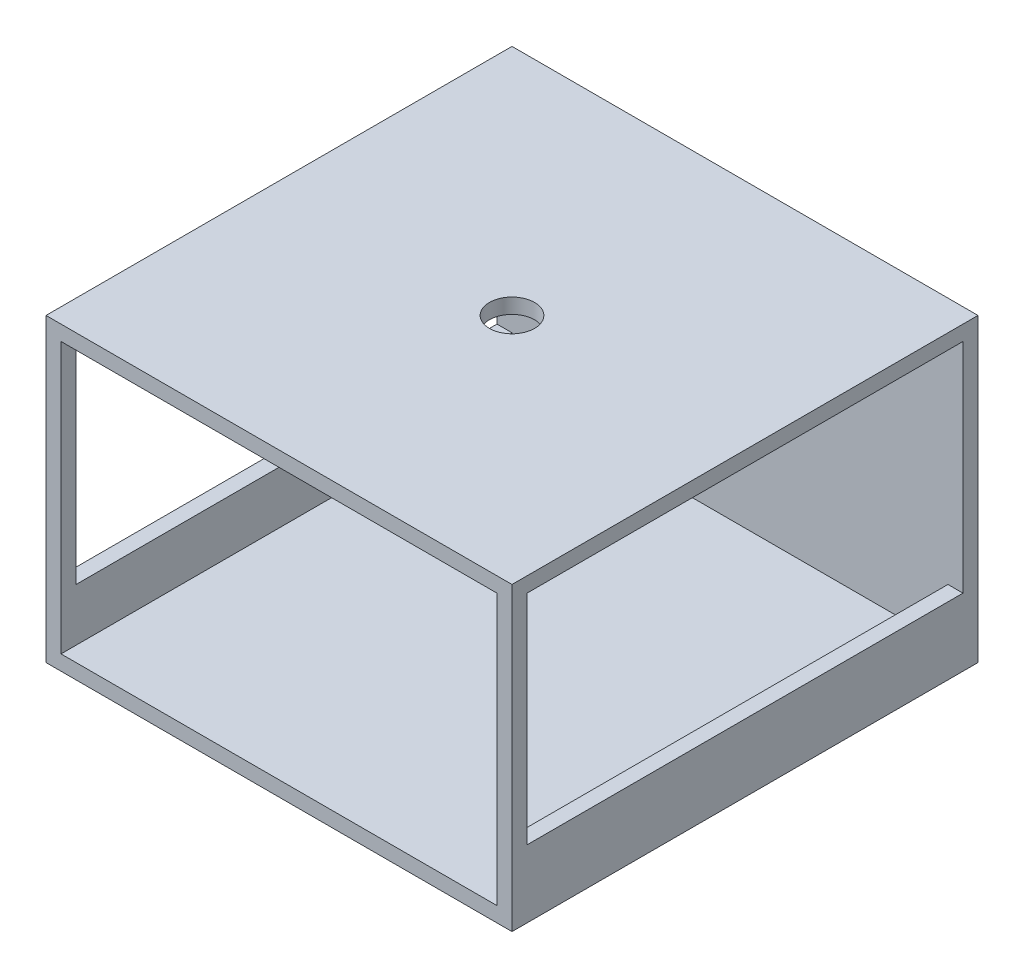
ISO-10303-21;
HEADER;
FILE_DESCRIPTION(('STEP AP214'),'2;1');
FILE_NAME('part.step','',(''),(''),'','','');
FILE_SCHEMA(('AUTOMOTIVE_DESIGN { 1 0 10303 214 1 1 1 1 }'));
ENDSEC;
DATA;
#1=APPLICATION_CONTEXT('core data for automotive mechanical design processes');
#2=APPLICATION_PROTOCOL_DEFINITION('international standard','automotive_design',2000,#1);
#3=PRODUCT_CONTEXT('',#1,'mechanical');
#4=PRODUCT('Part','Part','',(#3));
#5=PRODUCT_RELATED_PRODUCT_CATEGORY('part','',(#4));
#6=PRODUCT_DEFINITION_FORMATION('','',#4);
#7=PRODUCT_DEFINITION_CONTEXT('part definition',#1,'design');
#8=PRODUCT_DEFINITION('design','',#6,#7);
#9=PRODUCT_DEFINITION_SHAPE('','',#8);
#10=(LENGTH_UNIT() NAMED_UNIT(*) SI_UNIT(.MILLI.,.METRE.));
#11=(NAMED_UNIT(*) PLANE_ANGLE_UNIT() SI_UNIT($,.RADIAN.));
#12=(NAMED_UNIT(*) SI_UNIT($,.STERADIAN.) SOLID_ANGLE_UNIT());
#13=UNCERTAINTY_MEASURE_WITH_UNIT(LENGTH_MEASURE(1.E-05),#10,'distance_accuracy_value','');
#14=(GEOMETRIC_REPRESENTATION_CONTEXT(3) GLOBAL_UNCERTAINTY_ASSIGNED_CONTEXT((#13)) GLOBAL_UNIT_ASSIGNED_CONTEXT((#10,
#11,#12)) REPRESENTATION_CONTEXT('',''));
#15=CARTESIAN_POINT('',(0.,0.,0.));
#16=DIRECTION('',(0.,0.,1.));
#17=DIRECTION('',(1.,0.,0.));
#18=AXIS2_PLACEMENT_3D('',#15,#16,#17);
#19=CARTESIAN_POINT('',(-77.5,100.,77.5));
#20=DIRECTION('',(0.,0.,-1.));
#21=DIRECTION('',(-1.,0.,0.));
#22=AXIS2_PLACEMENT_3D('',#19,#20,#21);
#23=PLANE('',#22);
#24=DIRECTION('',(1.,0.,0.));
#25=VECTOR('',#24,1.);
#26=CARTESIAN_POINT('',(-77.5,0.,77.5));
#27=LINE('',#26,#25);
#28=CARTESIAN_POINT('',(-77.5,0.,77.5));
#29=VERTEX_POINT('',#28);
#30=CARTESIAN_POINT('',(77.5,0.,77.5));
#31=VERTEX_POINT('',#30);
#32=EDGE_CURVE('E217',#29,#31,#27,.T.);
#33=ORIENTED_EDGE('',*,*,#32,.T.);
#34=DIRECTION('',(0.,-1.,0.));
#35=VECTOR('',#34,1.);
#36=CARTESIAN_POINT('',(77.5,100.,77.5));
#37=LINE('',#36,#35);
#38=CARTESIAN_POINT('',(77.5,100.,77.5));
#39=VERTEX_POINT('',#38);
#40=EDGE_CURVE('E223',#39,#31,#37,.T.);
#41=ORIENTED_EDGE('',*,*,#40,.F.);
#42=DIRECTION('',(1.,0.,0.));
#43=VECTOR('',#42,1.);
#44=CARTESIAN_POINT('',(-77.5,100.,77.5));
#45=LINE('',#44,#43);
#46=CARTESIAN_POINT('',(-77.5,100.,77.5));
#47=VERTEX_POINT('',#46);
#48=EDGE_CURVE('E221',#47,#39,#45,.T.);
#49=ORIENTED_EDGE('',*,*,#48,.F.);
#50=DIRECTION('',(0.,-1.,0.));
#51=VECTOR('',#50,1.);
#52=CARTESIAN_POINT('',(-77.5,100.,77.5));
#53=LINE('',#52,#51);
#54=EDGE_CURVE('E233',#47,#29,#53,.T.);
#55=ORIENTED_EDGE('',*,*,#54,.T.);
#56=EDGE_LOOP('',(#33,#41,#49,#55));
#57=FACE_BOUND('',#56,.T.);
#58=DIRECTION('',(1.,0.,0.));
#59=VECTOR('',#58,1.);
#60=CARTESIAN_POINT('',(0.,5.,77.5));
#61=LINE('',#60,#59);
#62=CARTESIAN_POINT('',(-72.5,5.,77.5));
#63=VERTEX_POINT('',#62);
#64=CARTESIAN_POINT('',(72.5,5.,77.5));
#65=VERTEX_POINT('',#64);
#66=EDGE_CURVE('E194',#63,#65,#61,.T.);
#67=ORIENTED_EDGE('',*,*,#66,.F.);
#68=DIRECTION('',(0.,-1.,0.));
#69=VECTOR('',#68,1.);
#70=CARTESIAN_POINT('',(-72.5,100.,77.5));
#71=LINE('',#70,#69);
#72=CARTESIAN_POINT('',(-72.5,95.,77.5));
#73=VERTEX_POINT('',#72);
#74=EDGE_CURVE('E199',#73,#63,#71,.T.);
#75=ORIENTED_EDGE('',*,*,#74,.F.);
#76=DIRECTION('',(1.,0.,0.));
#77=VECTOR('',#76,1.);
#78=CARTESIAN_POINT('',(0.,95.,77.5));
#79=LINE('',#78,#77);
#80=CARTESIAN_POINT('',(72.5,95.,77.5));
#81=VERTEX_POINT('',#80);
#82=EDGE_CURVE('E204',#73,#81,#79,.T.);
#83=ORIENTED_EDGE('',*,*,#82,.T.);
#84=DIRECTION('',(0.,-1.,0.));
#85=VECTOR('',#84,1.);
#86=CARTESIAN_POINT('',(72.5,100.,77.5));
#87=LINE('',#86,#85);
#88=EDGE_CURVE('E205',#81,#65,#87,.T.);
#89=ORIENTED_EDGE('',*,*,#88,.T.);
#90=EDGE_LOOP('',(#67,#75,#83,#89));
#91=FACE_BOUND('',#90,.T.);
#92=ADVANCED_FACE('F35',(#57,#91),#23,.F.);
#93=CARTESIAN_POINT('',(77.5,100.,77.5));
#94=DIRECTION('',(-1.,0.,0.));
#95=DIRECTION('',(0.,0.,1.));
#96=AXIS2_PLACEMENT_3D('',#93,#94,#95);
#97=PLANE('',#96);
#98=DIRECTION('',(0.,0.,1.));
#99=VECTOR('',#98,1.);
#100=CARTESIAN_POINT('',(77.5,95.,-72.5));
#101=LINE('',#100,#99);
#102=CARTESIAN_POINT('',(77.5,95.,-72.5));
#103=VERTEX_POINT('',#102);
#104=CARTESIAN_POINT('',(77.5,95.,72.5));
#105=VERTEX_POINT('',#104);
#106=EDGE_CURVE('E394',#103,#105,#101,.T.);
#107=ORIENTED_EDGE('',*,*,#106,.F.);
#108=DIRECTION('',(0.,1.,0.));
#109=VECTOR('',#108,1.);
#110=CARTESIAN_POINT('',(77.5,95.,-72.5));
#111=LINE('',#110,#109);
#112=CARTESIAN_POINT('',(77.5,22.5,-72.5));
#113=VERTEX_POINT('',#112);
#114=EDGE_CURVE('E170',#113,#103,#111,.T.);
#115=ORIENTED_EDGE('',*,*,#114,.F.);
#116=DIRECTION('',(0.,0.,-1.));
#117=VECTOR('',#116,1.);
#118=CARTESIAN_POINT('',(77.5,22.5,-72.5));
#119=LINE('',#118,#117);
#120=CARTESIAN_POINT('',(77.5,22.5,72.5));
#121=VERTEX_POINT('',#120);
#122=EDGE_CURVE('E168',#121,#113,#119,.T.);
#123=ORIENTED_EDGE('',*,*,#122,.F.);
#124=DIRECTION('',(0.,-1.,0.));
#125=VECTOR('',#124,1.);
#126=CARTESIAN_POINT('',(77.5,95.,72.5));
#127=LINE('',#126,#125);
#128=EDGE_CURVE('E164',#105,#121,#127,.T.);
#129=ORIENTED_EDGE('',*,*,#128,.F.);
#130=EDGE_LOOP('',(#107,#115,#123,#129));
#131=FACE_BOUND('',#130,.T.);
#132=DIRECTION('',(0.,0.,-1.));
#133=VECTOR('',#132,1.);
#134=CARTESIAN_POINT('',(77.5,0.,77.5));
#135=LINE('',#134,#133);
#136=CARTESIAN_POINT('',(77.5,0.,-77.5));
#137=VERTEX_POINT('',#136);
#138=EDGE_CURVE('E188',#31,#137,#135,.T.);
#139=ORIENTED_EDGE('',*,*,#138,.T.);
#140=DIRECTION('',(0.,-1.,0.));
#141=VECTOR('',#140,1.);
#142=CARTESIAN_POINT('',(77.5,100.,-77.5));
#143=LINE('',#142,#141);
#144=CARTESIAN_POINT('',(77.5,100.,-77.5));
#145=VERTEX_POINT('',#144);
#146=EDGE_CURVE('E43',#145,#137,#143,.T.);
#147=ORIENTED_EDGE('',*,*,#146,.F.);
#148=DIRECTION('',(0.,0.,-1.));
#149=VECTOR('',#148,1.);
#150=CARTESIAN_POINT('',(77.5,100.,77.5));
#151=LINE('',#150,#149);
#152=EDGE_CURVE('E213',#39,#145,#151,.T.);
#153=ORIENTED_EDGE('',*,*,#152,.F.);
#154=ORIENTED_EDGE('',*,*,#40,.T.);
#155=EDGE_LOOP('',(#139,#147,#153,#154));
#156=FACE_BOUND('',#155,.T.);
#157=ADVANCED_FACE('F37',(#131,#156),#97,.F.);
#158=CARTESIAN_POINT('',(-77.5,100.,-77.5));
#159=DIRECTION('',(0.,0.,1.));
#160=DIRECTION('',(1.,0.,0.));
#161=AXIS2_PLACEMENT_3D('',#158,#159,#160);
#162=PLANE('',#161);
#163=DIRECTION('',(-1.,0.,0.));
#164=VECTOR('',#163,1.);
#165=CARTESIAN_POINT('',(-77.5,0.,-77.5));
#166=LINE('',#165,#164);
#167=CARTESIAN_POINT('',(-77.5,0.,-77.5));
#168=VERTEX_POINT('',#167);
#169=EDGE_CURVE('E226',#137,#168,#166,.T.);
#170=ORIENTED_EDGE('',*,*,#169,.T.);
#171=DIRECTION('',(0.,-1.,0.));
#172=VECTOR('',#171,1.);
#173=CARTESIAN_POINT('',(-77.5,100.,-77.5));
#174=LINE('',#173,#172);
#175=CARTESIAN_POINT('',(-77.5,100.,-77.5));
#176=VERTEX_POINT('',#175);
#177=EDGE_CURVE('E236',#176,#168,#174,.T.);
#178=ORIENTED_EDGE('',*,*,#177,.F.);
#179=DIRECTION('',(-1.,0.,0.));
#180=VECTOR('',#179,1.);
#181=CARTESIAN_POINT('',(-77.5,100.,-77.5));
#182=LINE('',#181,#180);
#183=EDGE_CURVE('E216',#145,#176,#182,.T.);
#184=ORIENTED_EDGE('',*,*,#183,.F.);
#185=ORIENTED_EDGE('',*,*,#146,.T.);
#186=EDGE_LOOP('',(#170,#178,#184,#185));
#187=FACE_BOUND('',#186,.T.);
#188=ADVANCED_FACE('F241',(#187),#162,.F.);
#189=CARTESIAN_POINT('',(-77.5,100.,77.5));
#190=DIRECTION('',(1.,0.,0.));
#191=DIRECTION('',(0.,0.,-1.));
#192=AXIS2_PLACEMENT_3D('',#189,#190,#191);
#193=PLANE('',#192);
#194=DIRECTION('',(0.,0.,1.));
#195=VECTOR('',#194,1.);
#196=CARTESIAN_POINT('',(-77.5,22.5,-72.5));
#197=LINE('',#196,#195);
#198=CARTESIAN_POINT('',(-77.5,22.5,-72.5));
#199=VERTEX_POINT('',#198);
#200=CARTESIAN_POINT('',(-77.5,22.5,72.5));
#201=VERTEX_POINT('',#200);
#202=EDGE_CURVE('E149',#199,#201,#197,.T.);
#203=ORIENTED_EDGE('',*,*,#202,.F.);
#204=DIRECTION('',(0.,-1.,0.));
#205=VECTOR('',#204,1.);
#206=CARTESIAN_POINT('',(-77.5,95.,-72.5));
#207=LINE('',#206,#205);
#208=CARTESIAN_POINT('',(-77.5,95.,-72.5));
#209=VERTEX_POINT('',#208);
#210=EDGE_CURVE('E58',#209,#199,#207,.T.);
#211=ORIENTED_EDGE('',*,*,#210,.F.);
#212=DIRECTION('',(0.,0.,-1.));
#213=VECTOR('',#212,1.);
#214=CARTESIAN_POINT('',(-77.5,95.,-72.5));
#215=LINE('',#214,#213);
#216=CARTESIAN_POINT('',(-77.5,95.,72.5));
#217=VERTEX_POINT('',#216);
#218=EDGE_CURVE('E157',#217,#209,#215,.T.);
#219=ORIENTED_EDGE('',*,*,#218,.F.);
#220=DIRECTION('',(0.,1.,0.));
#221=VECTOR('',#220,1.);
#222=CARTESIAN_POINT('',(-77.5,95.,72.5));
#223=LINE('',#222,#221);
#224=EDGE_CURVE('E140',#201,#217,#223,.T.);
#225=ORIENTED_EDGE('',*,*,#224,.F.);
#226=EDGE_LOOP('',(#203,#211,#219,#225));
#227=FACE_BOUND('',#226,.T.);
#228=DIRECTION('',(0.,0.,1.));
#229=VECTOR('',#228,1.);
#230=CARTESIAN_POINT('',(-77.5,0.,77.5));
#231=LINE('',#230,#229);
#232=EDGE_CURVE('E228',#168,#29,#231,.T.);
#233=ORIENTED_EDGE('',*,*,#232,.T.);
#234=ORIENTED_EDGE('',*,*,#54,.F.);
#235=DIRECTION('',(0.,0.,1.));
#236=VECTOR('',#235,1.);
#237=CARTESIAN_POINT('',(-77.5,100.,77.5));
#238=LINE('',#237,#236);
#239=EDGE_CURVE('E219',#176,#47,#238,.T.);
#240=ORIENTED_EDGE('',*,*,#239,.F.);
#241=ORIENTED_EDGE('',*,*,#177,.T.);
#242=EDGE_LOOP('',(#233,#234,#240,#241));
#243=FACE_BOUND('',#242,.T.);
#244=ADVANCED_FACE('F154',(#227,#243),#193,.F.);
#245=CARTESIAN_POINT('',(0.,100.,0.));
#246=DIRECTION('',(0.,-1.,0.));
#247=DIRECTION('',(0.,0.,-1.));
#248=AXIS2_PLACEMENT_3D('',#245,#246,#247);
#249=PLANE('',#248);
#250=CARTESIAN_POINT('',(0.,100.,0.));
#251=DIRECTION('',(0.,1.,0.));
#252=DIRECTION('',(0.,0.,1.));
#253=AXIS2_PLACEMENT_3D('',#250,#251,#252);
#254=CIRCLE('',#253,7.5);
#255=CARTESIAN_POINT('',(0.,100.,7.5));
#256=VERTEX_POINT('',#255);
#257=EDGE_CURVE('E176',#256,#256,#254,.T.);
#258=ORIENTED_EDGE('',*,*,#257,.F.);
#259=EDGE_LOOP('',(#258));
#260=FACE_BOUND('',#259,.T.);
#261=ORIENTED_EDGE('',*,*,#152,.T.);
#262=ORIENTED_EDGE('',*,*,#183,.T.);
#263=ORIENTED_EDGE('',*,*,#239,.T.);
#264=ORIENTED_EDGE('',*,*,#48,.T.);
#265=EDGE_LOOP('',(#261,#262,#263,#264));
#266=FACE_BOUND('',#265,.T.);
#267=ADVANCED_FACE('F257',(#260,#266),#249,.F.);
#268=CARTESIAN_POINT('',(0.,0.,0.));
#269=DIRECTION('',(0.,-1.,0.));
#270=DIRECTION('',(0.,0.,-1.));
#271=AXIS2_PLACEMENT_3D('',#268,#269,#270);
#272=PLANE('',#271);
#273=ORIENTED_EDGE('',*,*,#138,.F.);
#274=ORIENTED_EDGE('',*,*,#32,.F.);
#275=ORIENTED_EDGE('',*,*,#232,.F.);
#276=ORIENTED_EDGE('',*,*,#169,.F.);
#277=EDGE_LOOP('',(#273,#274,#275,#276));
#278=FACE_BOUND('',#277,.T.);
#279=ADVANCED_FACE('F249',(#278),#272,.T.);
#280=CARTESIAN_POINT('',(72.5,100.,77.5));
#281=DIRECTION('',(-1.,0.,0.));
#282=DIRECTION('',(0.,0.,1.));
#283=AXIS2_PLACEMENT_3D('',#280,#281,#282);
#284=PLANE('',#283);
#285=DIRECTION('',(0.,1.,0.));
#286=VECTOR('',#285,1.);
#287=CARTESIAN_POINT('',(72.5,100.,72.5));
#288=LINE('',#287,#286);
#289=CARTESIAN_POINT('',(72.5,22.5,72.5));
#290=VERTEX_POINT('',#289);
#291=CARTESIAN_POINT('',(72.5,95.,72.5));
#292=VERTEX_POINT('',#291);
#293=EDGE_CURVE('E172',#290,#292,#288,.T.);
#294=ORIENTED_EDGE('',*,*,#293,.F.);
#295=DIRECTION('',(0.,0.,1.));
#296=VECTOR('',#295,1.);
#297=CARTESIAN_POINT('',(72.5,22.5,77.5));
#298=LINE('',#297,#296);
#299=CARTESIAN_POINT('',(72.5,22.5,-72.5));
#300=VERTEX_POINT('',#299);
#301=EDGE_CURVE('E174',#300,#290,#298,.T.);
#302=ORIENTED_EDGE('',*,*,#301,.F.);
#303=DIRECTION('',(0.,-1.,0.));
#304=VECTOR('',#303,1.);
#305=CARTESIAN_POINT('',(72.5,100.,-72.5));
#306=LINE('',#305,#304);
#307=CARTESIAN_POINT('',(72.5,5.,-72.5));
#308=VERTEX_POINT('',#307);
#309=EDGE_CURVE('E186',#300,#308,#306,.T.);
#310=ORIENTED_EDGE('',*,*,#309,.T.);
#311=DIRECTION('',(0.,0.,-1.));
#312=VECTOR('',#311,1.);
#313=CARTESIAN_POINT('',(72.5,5.,0.));
#314=LINE('',#313,#312);
#315=EDGE_CURVE('E180',#65,#308,#314,.T.);
#316=ORIENTED_EDGE('',*,*,#315,.F.);
#317=ORIENTED_EDGE('',*,*,#88,.F.);
#318=DIRECTION('',(0.,0.,-1.));
#319=VECTOR('',#318,1.);
#320=CARTESIAN_POINT('',(72.5,95.,0.));
#321=LINE('',#320,#319);
#322=EDGE_CURVE('E190',#81,#292,#321,.T.);
#323=ORIENTED_EDGE('',*,*,#322,.T.);
#324=EDGE_LOOP('',(#294,#302,#310,#316,#317,#323));
#325=FACE_BOUND('',#324,.T.);
#326=ADVANCED_FACE('F265',(#325),#284,.T.);
#327=CARTESIAN_POINT('',(-77.5,100.,-72.5));
#328=DIRECTION('',(0.,0.,1.));
#329=DIRECTION('',(1.,0.,0.));
#330=AXIS2_PLACEMENT_3D('',#327,#328,#329);
#331=PLANE('',#330);
#332=ORIENTED_EDGE('',*,*,#309,.F.);
#333=DIRECTION('',(-1.,0.,0.));
#334=VECTOR('',#333,1.);
#335=CARTESIAN_POINT('',(239.614928368735,22.5,-72.5));
#336=LINE('',#335,#334);
#337=EDGE_CURVE('E146',#113,#300,#336,.T.);
#338=ORIENTED_EDGE('',*,*,#337,.F.);
#339=ORIENTED_EDGE('',*,*,#114,.T.);
#340=DIRECTION('',(-1.,0.,0.));
#341=VECTOR('',#340,1.);
#342=CARTESIAN_POINT('',(0.,95.,-72.5));
#343=LINE('',#342,#341);
#344=EDGE_CURVE('E193',#103,#209,#343,.T.);
#345=ORIENTED_EDGE('',*,*,#344,.T.);
#346=ORIENTED_EDGE('',*,*,#210,.T.);
#347=CARTESIAN_POINT('',(-72.5,22.5,-72.5));
#348=VERTEX_POINT('',#347);
#349=EDGE_CURVE('E151',#348,#199,#336,.T.);
#350=ORIENTED_EDGE('',*,*,#349,.F.);
#351=DIRECTION('',(0.,-1.,0.));
#352=VECTOR('',#351,1.);
#353=CARTESIAN_POINT('',(-72.5,100.,-72.5));
#354=LINE('',#353,#352);
#355=CARTESIAN_POINT('',(-72.5,5.,-72.5));
#356=VERTEX_POINT('',#355);
#357=EDGE_CURVE('E189',#348,#356,#354,.T.);
#358=ORIENTED_EDGE('',*,*,#357,.T.);
#359=DIRECTION('',(-1.,0.,0.));
#360=VECTOR('',#359,1.);
#361=CARTESIAN_POINT('',(0.,5.,-72.5));
#362=LINE('',#361,#360);
#363=EDGE_CURVE('E185',#308,#356,#362,.T.);
#364=ORIENTED_EDGE('',*,*,#363,.F.);
#365=EDGE_LOOP('',(#332,#338,#339,#345,#346,#350,#358,#364));
#366=FACE_BOUND('',#365,.T.);
#367=ADVANCED_FACE('F299',(#366),#331,.T.);
#368=CARTESIAN_POINT('',(-72.5,100.,77.5));
#369=DIRECTION('',(1.,0.,0.));
#370=DIRECTION('',(0.,0.,-1.));
#371=AXIS2_PLACEMENT_3D('',#368,#369,#370);
#372=PLANE('',#371);
#373=DIRECTION('',(0.,-1.,0.));
#374=VECTOR('',#373,1.);
#375=CARTESIAN_POINT('',(-72.5,100.,72.5));
#376=LINE('',#375,#374);
#377=CARTESIAN_POINT('',(-72.5,95.,72.5));
#378=VERTEX_POINT('',#377);
#379=CARTESIAN_POINT('',(-72.5,22.5,72.5));
#380=VERTEX_POINT('',#379);
#381=EDGE_CURVE('E143',#378,#380,#376,.T.);
#382=ORIENTED_EDGE('',*,*,#381,.F.);
#383=DIRECTION('',(0.,0.,1.));
#384=VECTOR('',#383,1.);
#385=CARTESIAN_POINT('',(-72.5,95.,0.));
#386=LINE('',#385,#384);
#387=EDGE_CURVE('E201',#378,#73,#386,.T.);
#388=ORIENTED_EDGE('',*,*,#387,.T.);
#389=ORIENTED_EDGE('',*,*,#74,.T.);
#390=DIRECTION('',(0.,0.,1.));
#391=VECTOR('',#390,1.);
#392=CARTESIAN_POINT('',(-72.5,5.,0.));
#393=LINE('',#392,#391);
#394=EDGE_CURVE('E197',#356,#63,#393,.T.);
#395=ORIENTED_EDGE('',*,*,#394,.F.);
#396=ORIENTED_EDGE('',*,*,#357,.F.);
#397=DIRECTION('',(0.,0.,-1.));
#398=VECTOR('',#397,1.);
#399=CARTESIAN_POINT('',(-72.5,22.5,77.5));
#400=LINE('',#399,#398);
#401=EDGE_CURVE('E11',#380,#348,#400,.T.);
#402=ORIENTED_EDGE('',*,*,#401,.F.);
#403=EDGE_LOOP('',(#382,#388,#389,#395,#396,#402));
#404=FACE_BOUND('',#403,.T.);
#405=ADVANCED_FACE('F311',(#404),#372,.T.);
#406=CARTESIAN_POINT('',(0.,95.,0.));
#407=DIRECTION('',(0.,-1.,0.));
#408=DIRECTION('',(0.,0.,-1.));
#409=AXIS2_PLACEMENT_3D('',#406,#407,#408);
#410=PLANE('',#409);
#411=ORIENTED_EDGE('',*,*,#387,.F.);
#412=DIRECTION('',(-1.,0.,0.));
#413=VECTOR('',#412,1.);
#414=CARTESIAN_POINT('',(239.614928368735,95.,72.5));
#415=LINE('',#414,#413);
#416=EDGE_CURVE('E165',#378,#217,#415,.T.);
#417=ORIENTED_EDGE('',*,*,#416,.T.);
#418=ORIENTED_EDGE('',*,*,#218,.T.);
#419=ORIENTED_EDGE('',*,*,#344,.F.);
#420=ORIENTED_EDGE('',*,*,#106,.T.);
#421=EDGE_CURVE('E162',#105,#292,#415,.T.);
#422=ORIENTED_EDGE('',*,*,#421,.T.);
#423=ORIENTED_EDGE('',*,*,#322,.F.);
#424=ORIENTED_EDGE('',*,*,#82,.F.);
#425=EDGE_LOOP('',(#411,#417,#418,#419,#420,#422,#423,#424));
#426=FACE_BOUND('',#425,.T.);
#427=CARTESIAN_POINT('',(0.,95.,0.));
#428=DIRECTION('',(0.,1.,0.));
#429=DIRECTION('',(0.,0.,1.));
#430=AXIS2_PLACEMENT_3D('',#427,#428,#429);
#431=CIRCLE('',#430,7.5);
#432=CARTESIAN_POINT('',(0.,95.,7.5));
#433=VERTEX_POINT('',#432);
#434=EDGE_CURVE('E177',#433,#433,#431,.T.);
#435=ORIENTED_EDGE('',*,*,#434,.T.);
#436=EDGE_LOOP('',(#435));
#437=FACE_BOUND('',#436,.T.);
#438=ADVANCED_FACE('F322',(#426,#437),#410,.T.);
#439=CARTESIAN_POINT('',(0.,5.,0.));
#440=DIRECTION('',(0.,-1.,0.));
#441=DIRECTION('',(0.,0.,-1.));
#442=AXIS2_PLACEMENT_3D('',#439,#440,#441);
#443=PLANE('',#442);
#444=ORIENTED_EDGE('',*,*,#315,.T.);
#445=ORIENTED_EDGE('',*,*,#363,.T.);
#446=ORIENTED_EDGE('',*,*,#394,.T.);
#447=ORIENTED_EDGE('',*,*,#66,.T.);
#448=EDGE_LOOP('',(#444,#445,#446,#447));
#449=FACE_BOUND('',#448,.T.);
#450=ADVANCED_FACE('F332',(#449),#443,.F.);
#451=CARTESIAN_POINT('',(0.,95.,0.));
#452=DIRECTION('',(0.,1.,0.));
#453=DIRECTION('',(0.,0.,1.));
#454=AXIS2_PLACEMENT_3D('',#451,#452,#453);
#455=CYLINDRICAL_SURFACE('',#454,7.5);
#456=ORIENTED_EDGE('',*,*,#434,.F.);
#457=EDGE_LOOP('',(#456));
#458=FACE_BOUND('',#457,.T.);
#459=ORIENTED_EDGE('',*,*,#257,.T.);
#460=EDGE_LOOP('',(#459));
#461=FACE_BOUND('',#460,.T.);
#462=ADVANCED_FACE('F343',(#458,#461),#455,.F.);
#463=CARTESIAN_POINT('',(239.614928368735,22.5,-72.5));
#464=DIRECTION('',(0.,-1.,0.));
#465=DIRECTION('',(0.,0.,-1.));
#466=AXIS2_PLACEMENT_3D('',#463,#464,#465);
#467=PLANE('',#466);
#468=ORIENTED_EDGE('',*,*,#401,.T.);
#469=ORIENTED_EDGE('',*,*,#349,.T.);
#470=ORIENTED_EDGE('',*,*,#202,.T.);
#471=DIRECTION('',(-1.,0.,0.));
#472=VECTOR('',#471,1.);
#473=CARTESIAN_POINT('',(239.614928368735,22.5,72.5));
#474=LINE('',#473,#472);
#475=EDGE_CURVE('E136',#380,#201,#474,.T.);
#476=ORIENTED_EDGE('',*,*,#475,.F.);
#477=EDGE_LOOP('',(#468,#469,#470,#476));
#478=FACE_BOUND('',#477,.T.);
#479=ADVANCED_FACE('F150',(#478),#467,.F.);
#480=CARTESIAN_POINT('',(239.614928368735,95.,72.5));
#481=DIRECTION('',(0.,0.,1.));
#482=DIRECTION('',(0.,-1.,0.));
#483=AXIS2_PLACEMENT_3D('',#480,#481,#482);
#484=PLANE('',#483);
#485=ORIENTED_EDGE('',*,*,#381,.T.);
#486=ORIENTED_EDGE('',*,*,#475,.T.);
#487=ORIENTED_EDGE('',*,*,#224,.T.);
#488=ORIENTED_EDGE('',*,*,#416,.F.);
#489=EDGE_LOOP('',(#485,#486,#487,#488));
#490=FACE_BOUND('',#489,.T.);
#491=ADVANCED_FACE('F138',(#490),#484,.F.);
#492=ORIENTED_EDGE('',*,*,#301,.T.);
#493=EDGE_CURVE('E50',#121,#290,#474,.T.);
#494=ORIENTED_EDGE('',*,*,#493,.F.);
#495=ORIENTED_EDGE('',*,*,#122,.T.);
#496=ORIENTED_EDGE('',*,*,#337,.T.);
#497=EDGE_LOOP('',(#492,#494,#495,#496));
#498=FACE_BOUND('',#497,.T.);
#499=ADVANCED_FACE('F345',(#498),#467,.F.);
#500=ORIENTED_EDGE('',*,*,#293,.T.);
#501=ORIENTED_EDGE('',*,*,#421,.F.);
#502=ORIENTED_EDGE('',*,*,#128,.T.);
#503=ORIENTED_EDGE('',*,*,#493,.T.);
#504=EDGE_LOOP('',(#500,#501,#502,#503));
#505=FACE_BOUND('',#504,.T.);
#506=ADVANCED_FACE('F355',(#505),#484,.F.);
#507=CLOSED_SHELL('',(#92,#157,#188,#244,#267,#279,#326,#367,#405,#438,#450,#462,#479,#491,#499,#506));
#508=MANIFOLD_SOLID_BREP('B2',#507);
#509=ADVANCED_BREP_SHAPE_REPRESENTATION('',(#18,#508),#14);
#510=SHAPE_DEFINITION_REPRESENTATION(#9,#509);
ENDSEC;
END-ISO-10303-21;
